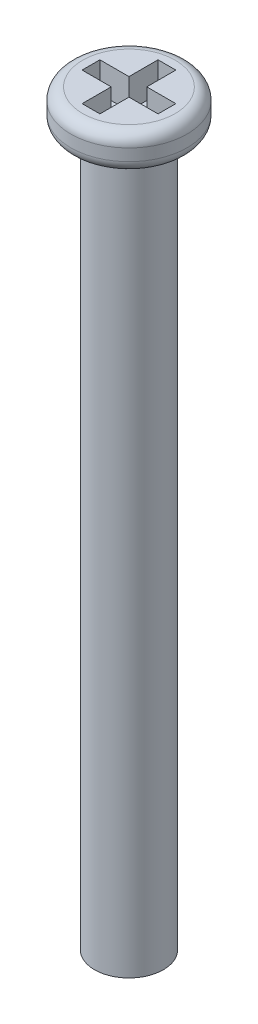
ISO-10303-21;
HEADER;
FILE_DESCRIPTION(('STEP AP214'),'2;1');
FILE_NAME('part.step','',(''),(''),'','','');
FILE_SCHEMA(('AUTOMOTIVE_DESIGN { 1 0 10303 214 1 1 1 1 }'));
ENDSEC;
DATA;
#1=APPLICATION_CONTEXT('core data for automotive mechanical design processes');
#2=APPLICATION_PROTOCOL_DEFINITION('international standard','automotive_design',2000,#1);
#3=PRODUCT_CONTEXT('',#1,'mechanical');
#4=PRODUCT('Part','Part','',(#3));
#5=PRODUCT_RELATED_PRODUCT_CATEGORY('part','',(#4));
#6=PRODUCT_DEFINITION_FORMATION('','',#4);
#7=PRODUCT_DEFINITION_CONTEXT('part definition',#1,'design');
#8=PRODUCT_DEFINITION('design','',#6,#7);
#9=PRODUCT_DEFINITION_SHAPE('','',#8);
#10=(LENGTH_UNIT() NAMED_UNIT(*) SI_UNIT(.MILLI.,.METRE.));
#11=(NAMED_UNIT(*) PLANE_ANGLE_UNIT() SI_UNIT($,.RADIAN.));
#12=(NAMED_UNIT(*) SI_UNIT($,.STERADIAN.) SOLID_ANGLE_UNIT());
#13=UNCERTAINTY_MEASURE_WITH_UNIT(LENGTH_MEASURE(1.E-05),#10,'distance_accuracy_value','');
#14=(GEOMETRIC_REPRESENTATION_CONTEXT(3) GLOBAL_UNCERTAINTY_ASSIGNED_CONTEXT((#13)) GLOBAL_UNIT_ASSIGNED_CONTEXT((#10,
#11,#12)) REPRESENTATION_CONTEXT('',''));
#15=CARTESIAN_POINT('',(0.,0.,0.));
#16=DIRECTION('',(0.,0.,1.));
#17=DIRECTION('',(1.,0.,0.));
#18=AXIS2_PLACEMENT_3D('',#15,#16,#17);
#19=CARTESIAN_POINT('',(0.,30.,0.));
#20=DIRECTION('',(0.,-1.,0.));
#21=DIRECTION('',(0.,0.,-1.));
#22=AXIS2_PLACEMENT_3D('',#19,#20,#21);
#23=CYLINDRICAL_SURFACE('',#22,1.45);
#24=CARTESIAN_POINT('',(0.,30.,0.));
#25=DIRECTION('',(0.,1.,0.));
#26=DIRECTION('',(0.,0.,1.));
#27=AXIS2_PLACEMENT_3D('',#24,#25,#26);
#28=CIRCLE('',#27,1.45);
#29=CARTESIAN_POINT('',(0.,30.,1.45));
#30=VERTEX_POINT('',#29);
#31=EDGE_CURVE('E178',#30,#30,#28,.T.);
#32=ORIENTED_EDGE('',*,*,#31,.F.);
#33=EDGE_LOOP('',(#32));
#34=FACE_BOUND('',#33,.T.);
#35=CARTESIAN_POINT('',(0.,0.,0.));
#36=DIRECTION('',(0.,1.,0.));
#37=DIRECTION('',(0.,0.,1.));
#38=AXIS2_PLACEMENT_3D('',#35,#36,#37);
#39=CIRCLE('',#38,1.45);
#40=CARTESIAN_POINT('',(0.,0.,1.45));
#41=VERTEX_POINT('',#40);
#42=EDGE_CURVE('E182',#41,#41,#39,.T.);
#43=ORIENTED_EDGE('',*,*,#42,.T.);
#44=EDGE_LOOP('',(#43));
#45=FACE_BOUND('',#44,.T.);
#46=ADVANCED_FACE('F32',(#34,#45),#23,.T.);
#47=CARTESIAN_POINT('',(0.,0.,0.));
#48=DIRECTION('',(0.,1.,0.));
#49=DIRECTION('',(0.,0.,1.));
#50=AXIS2_PLACEMENT_3D('',#47,#48,#49);
#51=PLANE('',#50);
#52=ORIENTED_EDGE('',*,*,#42,.F.);
#53=EDGE_LOOP('',(#52));
#54=FACE_BOUND('',#53,.T.);
#55=ADVANCED_FACE('F350',(#54),#51,.F.);
#56=CARTESIAN_POINT('',(0.,30.,0.));
#57=DIRECTION('',(0.,1.,0.));
#58=DIRECTION('',(0.,0.,1.));
#59=AXIS2_PLACEMENT_3D('',#56,#57,#58);
#60=PLANE('',#59);
#61=CARTESIAN_POINT('',(0.,30.,0.));
#62=DIRECTION('',(0.,1.,0.));
#63=DIRECTION('',(0.,0.,1.));
#64=AXIS2_PLACEMENT_3D('',#61,#62,#63);
#65=CIRCLE('',#64,1.95);
#66=CARTESIAN_POINT('',(0.,30.,1.95));
#67=VERTEX_POINT('',#66);
#68=EDGE_CURVE('E191',#67,#67,#65,.F.);
#69=ORIENTED_EDGE('',*,*,#68,.T.);
#70=EDGE_LOOP('',(#69));
#71=FACE_BOUND('',#70,.T.);
#72=ORIENTED_EDGE('',*,*,#31,.T.);
#73=EDGE_LOOP('',(#72));
#74=FACE_BOUND('',#73,.T.);
#75=ADVANCED_FACE('F356',(#71,#74),#60,.F.);
#76=CARTESIAN_POINT('',(0.,31.5,0.));
#77=DIRECTION('',(0.,-1.,0.));
#78=DIRECTION('',(0.,0.,-1.));
#79=AXIS2_PLACEMENT_3D('',#76,#77,#78);
#80=CYLINDRICAL_SURFACE('',#79,2.45);
#81=CARTESIAN_POINT('',(0.,30.5,0.));
#82=DIRECTION('',(0.,1.,0.));
#83=DIRECTION('',(0.,0.,1.));
#84=AXIS2_PLACEMENT_3D('',#81,#82,#83);
#85=CIRCLE('',#84,2.45);
#86=CARTESIAN_POINT('',(0.,30.5,2.45));
#87=VERTEX_POINT('',#86);
#88=EDGE_CURVE('E188',#87,#87,#85,.T.);
#89=ORIENTED_EDGE('',*,*,#88,.T.);
#90=EDGE_LOOP('',(#89));
#91=FACE_BOUND('',#90,.T.);
#92=CARTESIAN_POINT('',(0.,31.,0.));
#93=DIRECTION('',(0.,1.,0.));
#94=DIRECTION('',(0.,0.,1.));
#95=AXIS2_PLACEMENT_3D('',#92,#93,#94);
#96=CIRCLE('',#95,2.45);
#97=CARTESIAN_POINT('',(0.,31.,2.45));
#98=VERTEX_POINT('',#97);
#99=EDGE_CURVE('E181',#98,#98,#96,.F.);
#100=ORIENTED_EDGE('',*,*,#99,.T.);
#101=EDGE_LOOP('',(#100));
#102=FACE_BOUND('',#101,.T.);
#103=ADVANCED_FACE('F506',(#91,#102),#80,.T.);
#104=CARTESIAN_POINT('',(0.,31.5,0.));
#105=DIRECTION('',(0.,1.,0.));
#106=DIRECTION('',(0.,0.,1.));
#107=AXIS2_PLACEMENT_3D('',#104,#105,#106);
#108=PLANE('',#107);
#109=DIRECTION('',(0.,0.,1.));
#110=VECTOR('',#109,1.);
#111=CARTESIAN_POINT('',(-0.375,31.5,0.));
#112=LINE('',#111,#110);
#113=CARTESIAN_POINT('',(-0.375,31.5,-1.6));
#114=VERTEX_POINT('',#113);
#115=CARTESIAN_POINT('',(-0.375,31.5,-0.375));
#116=VERTEX_POINT('',#115);
#117=EDGE_CURVE('E168',#114,#116,#112,.T.);
#118=ORIENTED_EDGE('',*,*,#117,.F.);
#119=DIRECTION('',(1.,0.,0.));
#120=VECTOR('',#119,1.);
#121=CARTESIAN_POINT('',(0.,31.5,-1.6));
#122=LINE('',#121,#120);
#123=CARTESIAN_POINT('',(0.375,31.5,-1.6));
#124=VERTEX_POINT('',#123);
#125=EDGE_CURVE('E164',#114,#124,#122,.T.);
#126=ORIENTED_EDGE('',*,*,#125,.T.);
#127=DIRECTION('',(0.,0.,1.));
#128=VECTOR('',#127,1.);
#129=CARTESIAN_POINT('',(0.375,31.5,0.));
#130=LINE('',#129,#128);
#131=CARTESIAN_POINT('',(0.375,31.5,-0.375));
#132=VERTEX_POINT('',#131);
#133=EDGE_CURVE('E295',#124,#132,#130,.T.);
#134=ORIENTED_EDGE('',*,*,#133,.T.);
#135=DIRECTION('',(1.,0.,0.));
#136=VECTOR('',#135,1.);
#137=CARTESIAN_POINT('',(0.,31.5,-0.375));
#138=LINE('',#137,#136);
#139=CARTESIAN_POINT('',(1.6,31.5,-0.375));
#140=VERTEX_POINT('',#139);
#141=EDGE_CURVE('E293',#132,#140,#138,.T.);
#142=ORIENTED_EDGE('',*,*,#141,.T.);
#143=DIRECTION('',(0.,0.,1.));
#144=VECTOR('',#143,1.);
#145=CARTESIAN_POINT('',(1.6,31.5,0.));
#146=LINE('',#145,#144);
#147=CARTESIAN_POINT('',(1.6,31.5,0.375));
#148=VERTEX_POINT('',#147);
#149=EDGE_CURVE('E290',#140,#148,#146,.T.);
#150=ORIENTED_EDGE('',*,*,#149,.T.);
#151=DIRECTION('',(1.,0.,0.));
#152=VECTOR('',#151,1.);
#153=CARTESIAN_POINT('',(0.,31.5,0.375));
#154=LINE('',#153,#152);
#155=CARTESIAN_POINT('',(0.375,31.5,0.375));
#156=VERTEX_POINT('',#155);
#157=EDGE_CURVE('E287',#156,#148,#154,.T.);
#158=ORIENTED_EDGE('',*,*,#157,.F.);
#159=DIRECTION('',(0.,0.,1.));
#160=VECTOR('',#159,1.);
#161=CARTESIAN_POINT('',(0.375,31.5,0.));
#162=LINE('',#161,#160);
#163=CARTESIAN_POINT('',(0.375,31.5,1.6));
#164=VERTEX_POINT('',#163);
#165=EDGE_CURVE('E284',#156,#164,#162,.T.);
#166=ORIENTED_EDGE('',*,*,#165,.T.);
#167=DIRECTION('',(1.,0.,0.));
#168=VECTOR('',#167,1.);
#169=CARTESIAN_POINT('',(0.,31.5,1.6));
#170=LINE('',#169,#168);
#171=CARTESIAN_POINT('',(-0.375,31.5,1.6));
#172=VERTEX_POINT('',#171);
#173=EDGE_CURVE('E278',#172,#164,#170,.T.);
#174=ORIENTED_EDGE('',*,*,#173,.F.);
#175=DIRECTION('',(0.,0.,1.));
#176=VECTOR('',#175,1.);
#177=CARTESIAN_POINT('',(-0.375,31.5,0.));
#178=LINE('',#177,#176);
#179=CARTESIAN_POINT('',(-0.375,31.5,0.375));
#180=VERTEX_POINT('',#179);
#181=EDGE_CURVE('E276',#180,#172,#178,.T.);
#182=ORIENTED_EDGE('',*,*,#181,.F.);
#183=DIRECTION('',(1.,0.,0.));
#184=VECTOR('',#183,1.);
#185=CARTESIAN_POINT('',(0.,31.5,0.375));
#186=LINE('',#185,#184);
#187=CARTESIAN_POINT('',(-1.6,31.5,0.375));
#188=VERTEX_POINT('',#187);
#189=EDGE_CURVE('E262',#188,#180,#186,.T.);
#190=ORIENTED_EDGE('',*,*,#189,.F.);
#191=DIRECTION('',(0.,0.,1.));
#192=VECTOR('',#191,1.);
#193=CARTESIAN_POINT('',(-1.6,31.5,0.));
#194=LINE('',#193,#192);
#195=CARTESIAN_POINT('',(-1.6,31.5,-0.375));
#196=VERTEX_POINT('',#195);
#197=EDGE_CURVE('E267',#196,#188,#194,.T.);
#198=ORIENTED_EDGE('',*,*,#197,.F.);
#199=DIRECTION('',(1.,0.,0.));
#200=VECTOR('',#199,1.);
#201=CARTESIAN_POINT('',(0.,31.5,-0.375));
#202=LINE('',#201,#200);
#203=EDGE_CURVE('E270',#196,#116,#202,.T.);
#204=ORIENTED_EDGE('',*,*,#203,.T.);
#205=EDGE_LOOP('',(#118,#126,#134,#142,#150,#158,#166,#174,#182,#190,#198,#204));
#206=FACE_BOUND('',#205,.T.);
#207=CARTESIAN_POINT('',(0.,31.5,0.));
#208=DIRECTION('',(0.,1.,0.));
#209=DIRECTION('',(0.,0.,1.));
#210=AXIS2_PLACEMENT_3D('',#207,#208,#209);
#211=CIRCLE('',#210,1.95);
#212=CARTESIAN_POINT('',(0.,31.5,1.95));
#213=VERTEX_POINT('',#212);
#214=EDGE_CURVE('E194',#213,#213,#211,.T.);
#215=ORIENTED_EDGE('',*,*,#214,.T.);
#216=EDGE_LOOP('',(#215));
#217=FACE_BOUND('',#216,.T.);
#218=ADVANCED_FACE('F272',(#206,#217),#108,.T.);
#219=CARTESIAN_POINT('',(0.,30.5,0.));
#220=DIRECTION('',(0.,1.,0.));
#221=DIRECTION('',(0.,0.,1.));
#222=AXIS2_PLACEMENT_3D('',#219,#220,#221);
#223=TOROIDAL_SURFACE('',#222,1.95,0.5);
#224=ORIENTED_EDGE('',*,*,#68,.F.);
#225=EDGE_LOOP('',(#224));
#226=FACE_BOUND('',#225,.T.);
#227=ORIENTED_EDGE('',*,*,#88,.F.);
#228=EDGE_LOOP('',(#227));
#229=FACE_BOUND('',#228,.T.);
#230=ADVANCED_FACE('F363',(#226,#229),#223,.T.);
#231=CARTESIAN_POINT('',(0.,31.,0.));
#232=DIRECTION('',(0.,1.,0.));
#233=DIRECTION('',(0.,0.,1.));
#234=AXIS2_PLACEMENT_3D('',#231,#232,#233);
#235=TOROIDAL_SURFACE('',#234,1.95,0.5);
#236=ORIENTED_EDGE('',*,*,#99,.F.);
#237=EDGE_LOOP('',(#236));
#238=FACE_BOUND('',#237,.T.);
#239=ORIENTED_EDGE('',*,*,#214,.F.);
#240=EDGE_LOOP('',(#239));
#241=FACE_BOUND('',#240,.T.);
#242=ADVANCED_FACE('F366',(#238,#241),#235,.T.);
#243=CARTESIAN_POINT('',(-0.375,30.25,0.));
#244=DIRECTION('',(-1.,0.,0.));
#245=DIRECTION('',(0.,0.,1.));
#246=AXIS2_PLACEMENT_3D('',#243,#244,#245);
#247=PLANE('',#246);
#248=DIRECTION('',(0.,0.,1.));
#249=VECTOR('',#248,1.);
#250=CARTESIAN_POINT('',(-0.375,30.25,0.));
#251=LINE('',#250,#249);
#252=CARTESIAN_POINT('',(-0.375,30.25,-1.1));
#253=VERTEX_POINT('',#252);
#254=CARTESIAN_POINT('',(-0.375,30.25,-0.375));
#255=VERTEX_POINT('',#254);
#256=EDGE_CURVE('E158',#253,#255,#251,.T.);
#257=ORIENTED_EDGE('',*,*,#256,.F.);
#258=CARTESIAN_POINT('',(-0.375,30.75,-1.1));
#259=DIRECTION('',(-1.,0.,0.));
#260=DIRECTION('',(0.,0.,1.));
#261=AXIS2_PLACEMENT_3D('',#258,#259,#260);
#262=CIRCLE('',#261,0.5);
#263=CARTESIAN_POINT('',(-0.375,30.75,-1.6));
#264=VERTEX_POINT('',#263);
#265=EDGE_CURVE('E11',#253,#264,#262,.F.);
#266=ORIENTED_EDGE('',*,*,#265,.T.);
#267=DIRECTION('',(0.,1.,0.));
#268=VECTOR('',#267,1.);
#269=CARTESIAN_POINT('',(-0.375,30.25,-1.6));
#270=LINE('',#269,#268);
#271=EDGE_CURVE('E185',#264,#114,#270,.T.);
#272=ORIENTED_EDGE('',*,*,#271,.T.);
#273=ORIENTED_EDGE('',*,*,#117,.T.);
#274=DIRECTION('',(0.,1.,0.));
#275=VECTOR('',#274,1.);
#276=CARTESIAN_POINT('',(-0.375,30.25,-0.375));
#277=LINE('',#276,#275);
#278=EDGE_CURVE('E150',#255,#116,#277,.T.);
#279=ORIENTED_EDGE('',*,*,#278,.F.);
#280=EDGE_LOOP('',(#257,#266,#272,#273,#279));
#281=FACE_BOUND('',#280,.T.);
#282=ADVANCED_FACE('F166',(#281),#247,.F.);
#283=CARTESIAN_POINT('',(0.,30.25,-1.6));
#284=DIRECTION('',(0.,0.,1.));
#285=DIRECTION('',(1.,0.,0.));
#286=AXIS2_PLACEMENT_3D('',#283,#284,#285);
#287=PLANE('',#286);
#288=ORIENTED_EDGE('',*,*,#271,.F.);
#289=DIRECTION('',(1.,0.,0.));
#290=VECTOR('',#289,1.);
#291=CARTESIAN_POINT('',(0.375,30.75,-1.6));
#292=LINE('',#291,#290);
#293=CARTESIAN_POINT('',(0.375,30.75,-1.6));
#294=VERTEX_POINT('',#293);
#295=EDGE_CURVE('E223',#264,#294,#292,.T.);
#296=ORIENTED_EDGE('',*,*,#295,.T.);
#297=DIRECTION('',(0.,1.,0.));
#298=VECTOR('',#297,1.);
#299=CARTESIAN_POINT('',(0.375,30.25,-1.6));
#300=LINE('',#299,#298);
#301=EDGE_CURVE('E229',#294,#124,#300,.T.);
#302=ORIENTED_EDGE('',*,*,#301,.T.);
#303=ORIENTED_EDGE('',*,*,#125,.F.);
#304=EDGE_LOOP('',(#288,#296,#302,#303));
#305=FACE_BOUND('',#304,.T.);
#306=ADVANCED_FACE('F233',(#305),#287,.T.);
#307=CARTESIAN_POINT('',(0.375,30.25,0.));
#308=DIRECTION('',(-1.,0.,0.));
#309=DIRECTION('',(0.,0.,1.));
#310=AXIS2_PLACEMENT_3D('',#307,#308,#309);
#311=PLANE('',#310);
#312=ORIENTED_EDGE('',*,*,#301,.F.);
#313=CARTESIAN_POINT('',(0.375,30.75,-1.1));
#314=DIRECTION('',(-1.,0.,0.));
#315=DIRECTION('',(0.,0.,1.));
#316=AXIS2_PLACEMENT_3D('',#313,#314,#315);
#317=CIRCLE('',#316,0.5);
#318=CARTESIAN_POINT('',(0.375,30.25,-1.1));
#319=VERTEX_POINT('',#318);
#320=EDGE_CURVE('E40',#294,#319,#317,.T.);
#321=ORIENTED_EDGE('',*,*,#320,.T.);
#322=DIRECTION('',(0.,0.,1.));
#323=VECTOR('',#322,1.);
#324=CARTESIAN_POINT('',(0.375,30.25,0.));
#325=LINE('',#324,#323);
#326=CARTESIAN_POINT('',(0.375,30.25,-0.375));
#327=VERTEX_POINT('',#326);
#328=EDGE_CURVE('E170',#319,#327,#325,.T.);
#329=ORIENTED_EDGE('',*,*,#328,.T.);
#330=DIRECTION('',(0.,1.,0.));
#331=VECTOR('',#330,1.);
#332=CARTESIAN_POINT('',(0.375,30.25,-0.375));
#333=LINE('',#332,#331);
#334=EDGE_CURVE('E237',#327,#132,#333,.T.);
#335=ORIENTED_EDGE('',*,*,#334,.T.);
#336=ORIENTED_EDGE('',*,*,#133,.F.);
#337=EDGE_LOOP('',(#312,#321,#329,#335,#336));
#338=FACE_BOUND('',#337,.T.);
#339=ADVANCED_FACE('F226',(#338),#311,.T.);
#340=CARTESIAN_POINT('',(0.,30.25,-0.375));
#341=DIRECTION('',(0.,0.,1.));
#342=DIRECTION('',(1.,0.,0.));
#343=AXIS2_PLACEMENT_3D('',#340,#341,#342);
#344=PLANE('',#343);
#345=DIRECTION('',(1.,0.,0.));
#346=VECTOR('',#345,1.);
#347=CARTESIAN_POINT('',(0.,30.25,-0.375));
#348=LINE('',#347,#346);
#349=CARTESIAN_POINT('',(1.1,30.25,-0.375));
#350=VERTEX_POINT('',#349);
#351=EDGE_CURVE('E174',#327,#350,#348,.T.);
#352=ORIENTED_EDGE('',*,*,#351,.T.);
#353=CARTESIAN_POINT('',(1.1,30.75,-0.375));
#354=DIRECTION('',(0.,0.,1.));
#355=DIRECTION('',(1.,0.,0.));
#356=AXIS2_PLACEMENT_3D('',#353,#354,#355);
#357=CIRCLE('',#356,0.5);
#358=CARTESIAN_POINT('',(1.6,30.75,-0.375));
#359=VERTEX_POINT('',#358);
#360=EDGE_CURVE('E216',#350,#359,#357,.T.);
#361=ORIENTED_EDGE('',*,*,#360,.T.);
#362=DIRECTION('',(0.,1.,0.));
#363=VECTOR('',#362,1.);
#364=CARTESIAN_POINT('',(1.6,30.25,-0.375));
#365=LINE('',#364,#363);
#366=EDGE_CURVE('E243',#359,#140,#365,.T.);
#367=ORIENTED_EDGE('',*,*,#366,.T.);
#368=ORIENTED_EDGE('',*,*,#141,.F.);
#369=ORIENTED_EDGE('',*,*,#334,.F.);
#370=EDGE_LOOP('',(#352,#361,#367,#368,#369));
#371=FACE_BOUND('',#370,.T.);
#372=ADVANCED_FACE('F334',(#371),#344,.T.);
#373=CARTESIAN_POINT('',(1.6,30.25,0.));
#374=DIRECTION('',(-1.,0.,0.));
#375=DIRECTION('',(0.,0.,1.));
#376=AXIS2_PLACEMENT_3D('',#373,#374,#375);
#377=PLANE('',#376);
#378=ORIENTED_EDGE('',*,*,#366,.F.);
#379=DIRECTION('',(0.,0.,1.));
#380=VECTOR('',#379,1.);
#381=CARTESIAN_POINT('',(1.6,30.75,0.375));
#382=LINE('',#381,#380);
#383=CARTESIAN_POINT('',(1.6,30.75,0.375));
#384=VERTEX_POINT('',#383);
#385=EDGE_CURVE('E211',#359,#384,#382,.T.);
#386=ORIENTED_EDGE('',*,*,#385,.T.);
#387=DIRECTION('',(0.,1.,0.));
#388=VECTOR('',#387,1.);
#389=CARTESIAN_POINT('',(1.6,30.25,0.375));
#390=LINE('',#389,#388);
#391=EDGE_CURVE('E245',#384,#148,#390,.T.);
#392=ORIENTED_EDGE('',*,*,#391,.T.);
#393=ORIENTED_EDGE('',*,*,#149,.F.);
#394=EDGE_LOOP('',(#378,#386,#392,#393));
#395=FACE_BOUND('',#394,.T.);
#396=ADVANCED_FACE('F338',(#395),#377,.T.);
#397=CARTESIAN_POINT('',(0.,30.25,0.375));
#398=DIRECTION('',(0.,0.,1.));
#399=DIRECTION('',(1.,0.,0.));
#400=AXIS2_PLACEMENT_3D('',#397,#398,#399);
#401=PLANE('',#400);
#402=ORIENTED_EDGE('',*,*,#391,.F.);
#403=CARTESIAN_POINT('',(1.1,30.75,0.375));
#404=DIRECTION('',(0.,0.,1.));
#405=DIRECTION('',(1.,0.,0.));
#406=AXIS2_PLACEMENT_3D('',#403,#404,#405);
#407=CIRCLE('',#406,0.5);
#408=CARTESIAN_POINT('',(1.1,30.25,0.375));
#409=VERTEX_POINT('',#408);
#410=EDGE_CURVE('E214',#384,#409,#407,.F.);
#411=ORIENTED_EDGE('',*,*,#410,.T.);
#412=DIRECTION('',(1.,0.,0.));
#413=VECTOR('',#412,1.);
#414=CARTESIAN_POINT('',(0.,30.25,0.375));
#415=LINE('',#414,#413);
#416=CARTESIAN_POINT('',(0.375,30.25,0.375));
#417=VERTEX_POINT('',#416);
#418=EDGE_CURVE('E300',#417,#409,#415,.T.);
#419=ORIENTED_EDGE('',*,*,#418,.F.);
#420=DIRECTION('',(0.,1.,0.));
#421=VECTOR('',#420,1.);
#422=CARTESIAN_POINT('',(0.375,30.25,0.375));
#423=LINE('',#422,#421);
#424=EDGE_CURVE('E247',#417,#156,#423,.T.);
#425=ORIENTED_EDGE('',*,*,#424,.T.);
#426=ORIENTED_EDGE('',*,*,#157,.T.);
#427=EDGE_LOOP('',(#402,#411,#419,#425,#426));
#428=FACE_BOUND('',#427,.T.);
#429=ADVANCED_FACE('F326',(#428),#401,.F.);
#430=CARTESIAN_POINT('',(0.375,30.25,0.));
#431=DIRECTION('',(-1.,0.,0.));
#432=DIRECTION('',(0.,0.,1.));
#433=AXIS2_PLACEMENT_3D('',#430,#431,#432);
#434=PLANE('',#433);
#435=DIRECTION('',(0.,0.,1.));
#436=VECTOR('',#435,1.);
#437=CARTESIAN_POINT('',(0.375,30.25,0.));
#438=LINE('',#437,#436);
#439=CARTESIAN_POINT('',(0.375,30.25,1.1));
#440=VERTEX_POINT('',#439);
#441=EDGE_CURVE('E303',#417,#440,#438,.T.);
#442=ORIENTED_EDGE('',*,*,#441,.T.);
#443=CARTESIAN_POINT('',(0.375,30.75,1.1));
#444=DIRECTION('',(-1.,0.,0.));
#445=DIRECTION('',(0.,0.,1.));
#446=AXIS2_PLACEMENT_3D('',#443,#444,#445);
#447=CIRCLE('',#446,0.5);
#448=CARTESIAN_POINT('',(0.375,30.75,1.6));
#449=VERTEX_POINT('',#448);
#450=EDGE_CURVE('E205',#440,#449,#447,.T.);
#451=ORIENTED_EDGE('',*,*,#450,.T.);
#452=DIRECTION('',(0.,1.,0.));
#453=VECTOR('',#452,1.);
#454=CARTESIAN_POINT('',(0.375,30.25,1.6));
#455=LINE('',#454,#453);
#456=EDGE_CURVE('E249',#449,#164,#455,.T.);
#457=ORIENTED_EDGE('',*,*,#456,.T.);
#458=ORIENTED_EDGE('',*,*,#165,.F.);
#459=ORIENTED_EDGE('',*,*,#424,.F.);
#460=EDGE_LOOP('',(#442,#451,#457,#458,#459));
#461=FACE_BOUND('',#460,.T.);
#462=ADVANCED_FACE('F320',(#461),#434,.T.);
#463=CARTESIAN_POINT('',(0.,30.25,1.6));
#464=DIRECTION('',(0.,0.,1.));
#465=DIRECTION('',(1.,0.,0.));
#466=AXIS2_PLACEMENT_3D('',#463,#464,#465);
#467=PLANE('',#466);
#468=ORIENTED_EDGE('',*,*,#456,.F.);
#469=DIRECTION('',(1.,0.,0.));
#470=VECTOR('',#469,1.);
#471=CARTESIAN_POINT('',(0.,30.75,1.6));
#472=LINE('',#471,#470);
#473=CARTESIAN_POINT('',(-0.375,30.75,1.6));
#474=VERTEX_POINT('',#473);
#475=EDGE_CURVE('E207',#449,#474,#472,.F.);
#476=ORIENTED_EDGE('',*,*,#475,.T.);
#477=DIRECTION('',(0.,1.,0.));
#478=VECTOR('',#477,1.);
#479=CARTESIAN_POINT('',(-0.375,30.25,1.6));
#480=LINE('',#479,#478);
#481=EDGE_CURVE('E251',#474,#172,#480,.T.);
#482=ORIENTED_EDGE('',*,*,#481,.T.);
#483=ORIENTED_EDGE('',*,*,#173,.T.);
#484=EDGE_LOOP('',(#468,#476,#482,#483));
#485=FACE_BOUND('',#484,.T.);
#486=ADVANCED_FACE('F340',(#485),#467,.F.);
#487=CARTESIAN_POINT('',(-0.375,30.25,0.));
#488=DIRECTION('',(-1.,0.,0.));
#489=DIRECTION('',(0.,0.,1.));
#490=AXIS2_PLACEMENT_3D('',#487,#488,#489);
#491=PLANE('',#490);
#492=ORIENTED_EDGE('',*,*,#481,.F.);
#493=CARTESIAN_POINT('',(-0.375,30.75,1.1));
#494=DIRECTION('',(-1.,0.,0.));
#495=DIRECTION('',(0.,0.,1.));
#496=AXIS2_PLACEMENT_3D('',#493,#494,#495);
#497=CIRCLE('',#496,0.5);
#498=CARTESIAN_POINT('',(-0.375,30.25,1.1));
#499=VERTEX_POINT('',#498);
#500=EDGE_CURVE('E209',#474,#499,#497,.F.);
#501=ORIENTED_EDGE('',*,*,#500,.T.);
#502=DIRECTION('',(0.,0.,1.));
#503=VECTOR('',#502,1.);
#504=CARTESIAN_POINT('',(-0.375,30.25,0.));
#505=LINE('',#504,#503);
#506=CARTESIAN_POINT('',(-0.375,30.25,0.375));
#507=VERTEX_POINT('',#506);
#508=EDGE_CURVE('E306',#507,#499,#505,.T.);
#509=ORIENTED_EDGE('',*,*,#508,.F.);
#510=DIRECTION('',(0.,1.,0.));
#511=VECTOR('',#510,1.);
#512=CARTESIAN_POINT('',(-0.375,30.25,0.375));
#513=LINE('',#512,#511);
#514=EDGE_CURVE('E253',#507,#180,#513,.T.);
#515=ORIENTED_EDGE('',*,*,#514,.T.);
#516=ORIENTED_EDGE('',*,*,#181,.T.);
#517=EDGE_LOOP('',(#492,#501,#509,#515,#516));
#518=FACE_BOUND('',#517,.T.);
#519=ADVANCED_FACE('F312',(#518),#491,.F.);
#520=CARTESIAN_POINT('',(0.,30.25,0.375));
#521=DIRECTION('',(0.,0.,1.));
#522=DIRECTION('',(1.,0.,0.));
#523=AXIS2_PLACEMENT_3D('',#520,#521,#522);
#524=PLANE('',#523);
#525=DIRECTION('',(1.,0.,0.));
#526=VECTOR('',#525,1.);
#527=CARTESIAN_POINT('',(0.,30.25,0.375));
#528=LINE('',#527,#526);
#529=CARTESIAN_POINT('',(-1.1,30.25,0.375));
#530=VERTEX_POINT('',#529);
#531=EDGE_CURVE('E157',#530,#507,#528,.T.);
#532=ORIENTED_EDGE('',*,*,#531,.F.);
#533=CARTESIAN_POINT('',(-1.1,30.75,0.375));
#534=DIRECTION('',(0.,0.,1.));
#535=DIRECTION('',(1.,0.,0.));
#536=AXIS2_PLACEMENT_3D('',#533,#534,#535);
#537=CIRCLE('',#536,0.5);
#538=CARTESIAN_POINT('',(-1.6,30.75,0.375));
#539=VERTEX_POINT('',#538);
#540=EDGE_CURVE('E218',#530,#539,#537,.F.);
#541=ORIENTED_EDGE('',*,*,#540,.T.);
#542=DIRECTION('',(0.,1.,0.));
#543=VECTOR('',#542,1.);
#544=CARTESIAN_POINT('',(-1.6,30.25,0.375));
#545=LINE('',#544,#543);
#546=EDGE_CURVE('E172',#539,#188,#545,.T.);
#547=ORIENTED_EDGE('',*,*,#546,.T.);
#548=ORIENTED_EDGE('',*,*,#189,.T.);
#549=ORIENTED_EDGE('',*,*,#514,.F.);
#550=EDGE_LOOP('',(#532,#541,#547,#548,#549));
#551=FACE_BOUND('',#550,.T.);
#552=ADVANCED_FACE('F259',(#551),#524,.F.);
#553=CARTESIAN_POINT('',(-1.6,30.25,0.));
#554=DIRECTION('',(-1.,0.,0.));
#555=DIRECTION('',(0.,0.,1.));
#556=AXIS2_PLACEMENT_3D('',#553,#554,#555);
#557=PLANE('',#556);
#558=ORIENTED_EDGE('',*,*,#546,.F.);
#559=DIRECTION('',(0.,0.,1.));
#560=VECTOR('',#559,1.);
#561=CARTESIAN_POINT('',(-1.6,30.75,0.));
#562=LINE('',#561,#560);
#563=CARTESIAN_POINT('',(-1.6,30.75,-0.375));
#564=VERTEX_POINT('',#563);
#565=EDGE_CURVE('E220',#539,#564,#562,.F.);
#566=ORIENTED_EDGE('',*,*,#565,.T.);
#567=DIRECTION('',(0.,1.,0.));
#568=VECTOR('',#567,1.);
#569=CARTESIAN_POINT('',(-1.6,30.25,-0.375));
#570=LINE('',#569,#568);
#571=EDGE_CURVE('E169',#564,#196,#570,.T.);
#572=ORIENTED_EDGE('',*,*,#571,.T.);
#573=ORIENTED_EDGE('',*,*,#197,.T.);
#574=EDGE_LOOP('',(#558,#566,#572,#573));
#575=FACE_BOUND('',#574,.T.);
#576=ADVANCED_FACE('F268',(#575),#557,.F.);
#577=CARTESIAN_POINT('',(0.,30.25,-0.375));
#578=DIRECTION('',(0.,0.,1.));
#579=DIRECTION('',(1.,0.,0.));
#580=AXIS2_PLACEMENT_3D('',#577,#578,#579);
#581=PLANE('',#580);
#582=ORIENTED_EDGE('',*,*,#571,.F.);
#583=CARTESIAN_POINT('',(-1.1,30.75,-0.375));
#584=DIRECTION('',(0.,0.,1.));
#585=DIRECTION('',(1.,0.,0.));
#586=AXIS2_PLACEMENT_3D('',#583,#584,#585);
#587=CIRCLE('',#586,0.5);
#588=CARTESIAN_POINT('',(-1.1,30.25,-0.375));
#589=VERTEX_POINT('',#588);
#590=EDGE_CURVE('E153',#564,#589,#587,.T.);
#591=ORIENTED_EDGE('',*,*,#590,.T.);
#592=DIRECTION('',(1.,0.,0.));
#593=VECTOR('',#592,1.);
#594=CARTESIAN_POINT('',(0.,30.25,-0.375));
#595=LINE('',#594,#593);
#596=EDGE_CURVE('E144',#589,#255,#595,.T.);
#597=ORIENTED_EDGE('',*,*,#596,.T.);
#598=ORIENTED_EDGE('',*,*,#278,.T.);
#599=ORIENTED_EDGE('',*,*,#203,.F.);
#600=EDGE_LOOP('',(#582,#591,#597,#598,#599));
#601=FACE_BOUND('',#600,.T.);
#602=ADVANCED_FACE('F147',(#601),#581,.T.);
#603=CARTESIAN_POINT('',(0.,30.25,0.));
#604=DIRECTION('',(0.,1.,0.));
#605=DIRECTION('',(0.,0.,1.));
#606=AXIS2_PLACEMENT_3D('',#603,#604,#605);
#607=PLANE('',#606);
#608=ORIENTED_EDGE('',*,*,#508,.T.);
#609=DIRECTION('',(1.,0.,0.));
#610=VECTOR('',#609,1.);
#611=CARTESIAN_POINT('',(0.,30.25,1.1));
#612=LINE('',#611,#610);
#613=EDGE_CURVE('E202',#499,#440,#612,.T.);
#614=ORIENTED_EDGE('',*,*,#613,.T.);
#615=ORIENTED_EDGE('',*,*,#441,.F.);
#616=ORIENTED_EDGE('',*,*,#418,.T.);
#617=DIRECTION('',(0.,0.,1.));
#618=VECTOR('',#617,1.);
#619=CARTESIAN_POINT('',(1.1,30.25,-0.375));
#620=LINE('',#619,#618);
#621=EDGE_CURVE('E200',#409,#350,#620,.F.);
#622=ORIENTED_EDGE('',*,*,#621,.T.);
#623=ORIENTED_EDGE('',*,*,#351,.F.);
#624=ORIENTED_EDGE('',*,*,#328,.F.);
#625=DIRECTION('',(1.,0.,0.));
#626=VECTOR('',#625,1.);
#627=CARTESIAN_POINT('',(-0.375,30.25,-1.1));
#628=LINE('',#627,#626);
#629=EDGE_CURVE('E163',#319,#253,#628,.F.);
#630=ORIENTED_EDGE('',*,*,#629,.T.);
#631=ORIENTED_EDGE('',*,*,#256,.T.);
#632=ORIENTED_EDGE('',*,*,#596,.F.);
#633=DIRECTION('',(0.,0.,1.));
#634=VECTOR('',#633,1.);
#635=CARTESIAN_POINT('',(-1.1,30.25,0.));
#636=LINE('',#635,#634);
#637=EDGE_CURVE('E198',#589,#530,#636,.T.);
#638=ORIENTED_EDGE('',*,*,#637,.T.);
#639=ORIENTED_EDGE('',*,*,#531,.T.);
#640=EDGE_LOOP('',(#608,#614,#615,#616,#622,#623,#624,#630,#631,#632,#638,#639));
#641=FACE_BOUND('',#640,.T.);
#642=ADVANCED_FACE('F161',(#641),#607,.T.);
#643=CARTESIAN_POINT('',(0.,30.75,1.1));
#644=DIRECTION('',(1.,0.,0.));
#645=DIRECTION('',(0.,0.,-1.));
#646=AXIS2_PLACEMENT_3D('',#643,#644,#645);
#647=CYLINDRICAL_SURFACE('',#646,0.5);
#648=ORIENTED_EDGE('',*,*,#500,.F.);
#649=ORIENTED_EDGE('',*,*,#475,.F.);
#650=ORIENTED_EDGE('',*,*,#450,.F.);
#651=ORIENTED_EDGE('',*,*,#613,.F.);
#652=EDGE_LOOP('',(#648,#649,#650,#651));
#653=FACE_BOUND('',#652,.T.);
#654=ADVANCED_FACE('F316',(#653),#647,.F.);
#655=CARTESIAN_POINT('',(1.1,30.75,0.));
#656=DIRECTION('',(0.,0.,-1.));
#657=DIRECTION('',(-1.,0.,0.));
#658=AXIS2_PLACEMENT_3D('',#655,#656,#657);
#659=CYLINDRICAL_SURFACE('',#658,0.5);
#660=ORIENTED_EDGE('',*,*,#360,.F.);
#661=ORIENTED_EDGE('',*,*,#621,.F.);
#662=ORIENTED_EDGE('',*,*,#410,.F.);
#663=ORIENTED_EDGE('',*,*,#385,.F.);
#664=EDGE_LOOP('',(#660,#661,#662,#663));
#665=FACE_BOUND('',#664,.T.);
#666=ADVANCED_FACE('F330',(#665),#659,.F.);
#667=CARTESIAN_POINT('',(-1.1,30.75,0.));
#668=DIRECTION('',(0.,0.,1.));
#669=DIRECTION('',(1.,0.,0.));
#670=AXIS2_PLACEMENT_3D('',#667,#668,#669);
#671=CYLINDRICAL_SURFACE('',#670,0.5);
#672=ORIENTED_EDGE('',*,*,#590,.F.);
#673=ORIENTED_EDGE('',*,*,#565,.F.);
#674=ORIENTED_EDGE('',*,*,#540,.F.);
#675=ORIENTED_EDGE('',*,*,#637,.F.);
#676=EDGE_LOOP('',(#672,#673,#674,#675));
#677=FACE_BOUND('',#676,.T.);
#678=ADVANCED_FACE('F374',(#677),#671,.F.);
#679=CARTESIAN_POINT('',(0.,30.75,-1.1));
#680=DIRECTION('',(-1.,0.,0.));
#681=DIRECTION('',(0.,0.,1.));
#682=AXIS2_PLACEMENT_3D('',#679,#680,#681);
#683=CYLINDRICAL_SURFACE('',#682,0.5);
#684=ORIENTED_EDGE('',*,*,#265,.F.);
#685=ORIENTED_EDGE('',*,*,#629,.F.);
#686=ORIENTED_EDGE('',*,*,#320,.F.);
#687=ORIENTED_EDGE('',*,*,#295,.F.);
#688=EDGE_LOOP('',(#684,#685,#686,#687));
#689=FACE_BOUND('',#688,.T.);
#690=ADVANCED_FACE('F34',(#689),#683,.F.);
#691=CLOSED_SHELL('',(#46,#55,#75,#103,#218,#230,#242,#282,#306,#339,#372,#396,#429,#462,#486,
#519,#552,#576,#602,#642,#654,#666,#678,#690));
#692=MANIFOLD_SOLID_BREP('B2',#691);
#693=ADVANCED_BREP_SHAPE_REPRESENTATION('',(#18,#692),#14);
#694=SHAPE_DEFINITION_REPRESENTATION(#9,#693);
ENDSEC;
END-ISO-10303-21;
